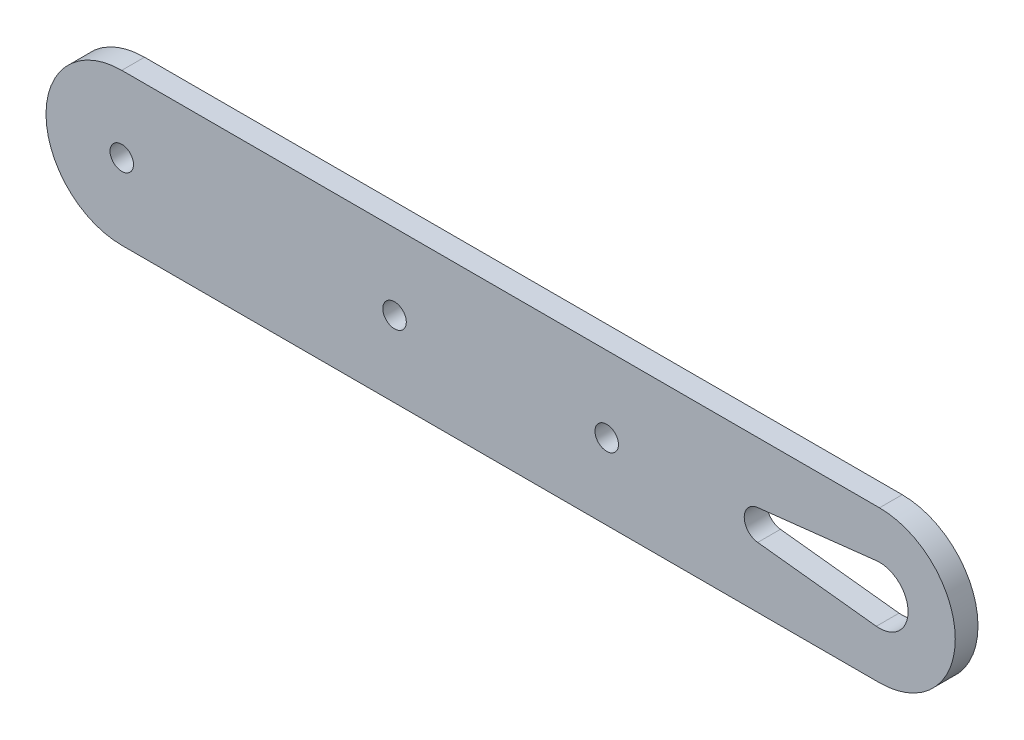
ISO-10303-21;
HEADER;
FILE_DESCRIPTION(('STEP AP214'),'2;1');
FILE_NAME('part.step','',(''),(''),'','','');
FILE_SCHEMA(('AUTOMOTIVE_DESIGN { 1 0 10303 214 1 1 1 1 }'));
ENDSEC;
DATA;
#1=APPLICATION_CONTEXT('core data for automotive mechanical design processes');
#2=APPLICATION_PROTOCOL_DEFINITION('international standard','automotive_design',2000,#1);
#3=PRODUCT_CONTEXT('',#1,'mechanical');
#4=PRODUCT('Part','Part','',(#3));
#5=PRODUCT_RELATED_PRODUCT_CATEGORY('part','',(#4));
#6=PRODUCT_DEFINITION_FORMATION('','',#4);
#7=PRODUCT_DEFINITION_CONTEXT('part definition',#1,'design');
#8=PRODUCT_DEFINITION('design','',#6,#7);
#9=PRODUCT_DEFINITION_SHAPE('','',#8);
#10=(LENGTH_UNIT() NAMED_UNIT(*) SI_UNIT(.MILLI.,.METRE.));
#11=(NAMED_UNIT(*) PLANE_ANGLE_UNIT() SI_UNIT($,.RADIAN.));
#12=(NAMED_UNIT(*) SI_UNIT($,.STERADIAN.) SOLID_ANGLE_UNIT());
#13=UNCERTAINTY_MEASURE_WITH_UNIT(LENGTH_MEASURE(1.E-05),#10,'distance_accuracy_value','');
#14=(GEOMETRIC_REPRESENTATION_CONTEXT(3) GLOBAL_UNCERTAINTY_ASSIGNED_CONTEXT((#13)) GLOBAL_UNIT_ASSIGNED_CONTEXT((#10,
#11,#12)) REPRESENTATION_CONTEXT('',''));
#15=CARTESIAN_POINT('',(0.,0.,0.));
#16=DIRECTION('',(0.,0.,1.));
#17=DIRECTION('',(1.,0.,0.));
#18=AXIS2_PLACEMENT_3D('',#15,#16,#17);
#19=CARTESIAN_POINT('',(-58.0586172408633,14.1910905170263,3.));
#20=DIRECTION('',(0.,0.,-1.));
#21=DIRECTION('',(-1.,0.,0.));
#22=AXIS2_PLACEMENT_3D('',#19,#20,#21);
#23=CYLINDRICAL_SURFACE('',#22,10.);
#24=CARTESIAN_POINT('',(-58.0586172408633,14.1910905170263,0.));
#25=DIRECTION('',(0.,0.,1.));
#26=DIRECTION('',(1.,0.,0.));
#27=AXIS2_PLACEMENT_3D('',#24,#25,#26);
#28=CIRCLE('',#27,10.);
#29=CARTESIAN_POINT('',(-58.0586172408633,24.1910905170263,0.));
#30=VERTEX_POINT('',#29);
#31=CARTESIAN_POINT('',(-58.0586172408633,4.19109051702633,0.));
#32=VERTEX_POINT('',#31);
#33=EDGE_CURVE('E156',#30,#32,#28,.T.);
#34=ORIENTED_EDGE('',*,*,#33,.T.);
#35=DIRECTION('',(0.,0.,-1.));
#36=VECTOR('',#35,1.);
#37=CARTESIAN_POINT('',(-58.0586172408633,4.19109051702633,3.));
#38=LINE('',#37,#36);
#39=CARTESIAN_POINT('',(-58.0586172408633,4.19109051702633,3.));
#40=VERTEX_POINT('',#39);
#41=EDGE_CURVE('E11',#40,#32,#38,.T.);
#42=ORIENTED_EDGE('',*,*,#41,.F.);
#43=CARTESIAN_POINT('',(-58.0586172408633,14.1910905170263,3.));
#44=DIRECTION('',(0.,0.,1.));
#45=DIRECTION('',(1.,0.,0.));
#46=AXIS2_PLACEMENT_3D('',#43,#44,#45);
#47=CIRCLE('',#46,10.);
#48=CARTESIAN_POINT('',(-58.0586172408633,24.1910905170263,3.));
#49=VERTEX_POINT('',#48);
#50=EDGE_CURVE('E162',#49,#40,#47,.T.);
#51=ORIENTED_EDGE('',*,*,#50,.F.);
#52=DIRECTION('',(0.,0.,-1.));
#53=VECTOR('',#52,1.);
#54=CARTESIAN_POINT('',(-58.0586172408633,24.1910905170263,3.));
#55=LINE('',#54,#53);
#56=EDGE_CURVE('E176',#49,#30,#55,.T.);
#57=ORIENTED_EDGE('',*,*,#56,.T.);
#58=EDGE_LOOP('',(#34,#42,#51,#57));
#59=FACE_BOUND('',#58,.T.);
#60=ADVANCED_FACE('F44',(#59),#23,.T.);
#61=CARTESIAN_POINT('',(-58.0586172408633,4.19109051702633,3.));
#62=DIRECTION('',(0.,1.,0.));
#63=DIRECTION('',(0.,0.,1.));
#64=AXIS2_PLACEMENT_3D('',#61,#62,#63);
#65=PLANE('',#64);
#66=DIRECTION('',(1.,0.,0.));
#67=VECTOR('',#66,1.);
#68=CARTESIAN_POINT('',(-58.0586172408633,4.19109051702633,0.));
#69=LINE('',#68,#67);
#70=CARTESIAN_POINT('',(41.9413827591368,4.19109051702633,0.));
#71=VERTEX_POINT('',#70);
#72=EDGE_CURVE('E180',#32,#71,#69,.T.);
#73=ORIENTED_EDGE('',*,*,#72,.T.);
#74=DIRECTION('',(0.,0.,-1.));
#75=VECTOR('',#74,1.);
#76=CARTESIAN_POINT('',(41.9413827591368,4.19109051702633,3.));
#77=LINE('',#76,#75);
#78=CARTESIAN_POINT('',(41.9413827591368,4.19109051702633,3.));
#79=VERTEX_POINT('',#78);
#80=EDGE_CURVE('E52',#79,#71,#77,.T.);
#81=ORIENTED_EDGE('',*,*,#80,.F.);
#82=DIRECTION('',(1.,0.,0.));
#83=VECTOR('',#82,1.);
#84=CARTESIAN_POINT('',(-58.0586172408633,4.19109051702633,3.));
#85=LINE('',#84,#83);
#86=EDGE_CURVE('E166',#40,#79,#85,.T.);
#87=ORIENTED_EDGE('',*,*,#86,.F.);
#88=ORIENTED_EDGE('',*,*,#41,.T.);
#89=EDGE_LOOP('',(#73,#81,#87,#88));
#90=FACE_BOUND('',#89,.T.);
#91=ADVANCED_FACE('F214',(#90),#65,.F.);
#92=CARTESIAN_POINT('',(41.9413827591368,14.1910905170263,3.));
#93=DIRECTION('',(0.,0.,-1.));
#94=DIRECTION('',(-1.,0.,0.));
#95=AXIS2_PLACEMENT_3D('',#92,#93,#94);
#96=CYLINDRICAL_SURFACE('',#95,10.);
#97=CARTESIAN_POINT('',(41.9413827591368,14.1910905170263,0.));
#98=DIRECTION('',(0.,0.,1.));
#99=DIRECTION('',(1.,0.,0.));
#100=AXIS2_PLACEMENT_3D('',#97,#98,#99);
#101=CIRCLE('',#100,10.);
#102=CARTESIAN_POINT('',(41.9413827591368,24.1910905170263,0.));
#103=VERTEX_POINT('',#102);
#104=EDGE_CURVE('E183',#71,#103,#101,.T.);
#105=ORIENTED_EDGE('',*,*,#104,.T.);
#106=DIRECTION('',(0.,0.,-1.));
#107=VECTOR('',#106,1.);
#108=CARTESIAN_POINT('',(41.9413827591368,24.1910905170263,3.));
#109=LINE('',#108,#107);
#110=CARTESIAN_POINT('',(41.9413827591368,24.1910905170263,3.));
#111=VERTEX_POINT('',#110);
#112=EDGE_CURVE('E191',#111,#103,#109,.T.);
#113=ORIENTED_EDGE('',*,*,#112,.F.);
#114=CARTESIAN_POINT('',(41.9413827591368,14.1910905170263,3.));
#115=DIRECTION('',(0.,0.,1.));
#116=DIRECTION('',(1.,0.,0.));
#117=AXIS2_PLACEMENT_3D('',#114,#115,#116);
#118=CIRCLE('',#117,10.);
#119=EDGE_CURVE('E170',#79,#111,#118,.T.);
#120=ORIENTED_EDGE('',*,*,#119,.F.);
#121=ORIENTED_EDGE('',*,*,#80,.T.);
#122=EDGE_LOOP('',(#105,#113,#120,#121));
#123=FACE_BOUND('',#122,.T.);
#124=ADVANCED_FACE('F200',(#123),#96,.T.);
#125=CARTESIAN_POINT('',(-58.0586172408633,24.1910905170263,3.));
#126=DIRECTION('',(0.,-1.,0.));
#127=DIRECTION('',(0.,0.,-1.));
#128=AXIS2_PLACEMENT_3D('',#125,#126,#127);
#129=PLANE('',#128);
#130=DIRECTION('',(-1.,0.,0.));
#131=VECTOR('',#130,1.);
#132=CARTESIAN_POINT('',(-58.0586172408633,24.1910905170263,0.));
#133=LINE('',#132,#131);
#134=EDGE_CURVE('E167',#103,#30,#133,.T.);
#135=ORIENTED_EDGE('',*,*,#134,.T.);
#136=ORIENTED_EDGE('',*,*,#56,.F.);
#137=DIRECTION('',(-1.,0.,0.));
#138=VECTOR('',#137,1.);
#139=CARTESIAN_POINT('',(-58.0586172408633,24.1910905170263,3.));
#140=LINE('',#139,#138);
#141=EDGE_CURVE('E173',#111,#49,#140,.T.);
#142=ORIENTED_EDGE('',*,*,#141,.F.);
#143=ORIENTED_EDGE('',*,*,#112,.T.);
#144=EDGE_LOOP('',(#135,#136,#142,#143));
#145=FACE_BOUND('',#144,.T.);
#146=ADVANCED_FACE('F207',(#145),#129,.F.);
#147=CARTESIAN_POINT('',(-58.0586172408633,14.1910905170263,3.));
#148=DIRECTION('',(0.,0.,1.));
#149=DIRECTION('',(1.,0.,0.));
#150=AXIS2_PLACEMENT_3D('',#147,#148,#149);
#151=PLANE('',#150);
#152=CARTESIAN_POINT('',(-22.0586172408633,14.1910905170263,3.));
#153=DIRECTION('',(0.,0.,-1.));
#154=DIRECTION('',(-1.,0.,0.));
#155=AXIS2_PLACEMENT_3D('',#152,#153,#154);
#156=CIRCLE('',#155,1.55);
#157=CARTESIAN_POINT('',(-23.6086172408633,14.1910905170263,3.));
#158=VERTEX_POINT('',#157);
#159=EDGE_CURVE('E257',#158,#158,#156,.T.);
#160=ORIENTED_EDGE('',*,*,#159,.T.);
#161=EDGE_LOOP('',(#160));
#162=FACE_BOUND('',#161,.T.);
#163=CARTESIAN_POINT('',(5.94138275913676,14.1910905170263,3.));
#164=DIRECTION('',(0.,0.,1.));
#165=DIRECTION('',(1.,0.,0.));
#166=AXIS2_PLACEMENT_3D('',#163,#164,#165);
#167=CIRCLE('',#166,1.55);
#168=CARTESIAN_POINT('',(7.49138275913676,14.1910905170263,3.));
#169=VERTEX_POINT('',#168);
#170=EDGE_CURVE('E264',#169,#169,#167,.T.);
#171=ORIENTED_EDGE('',*,*,#170,.F.);
#172=EDGE_LOOP('',(#171));
#173=FACE_BOUND('',#172,.T.);
#174=CARTESIAN_POINT('',(-58.0586172408633,14.1910905170263,3.));
#175=DIRECTION('',(0.,0.,1.));
#176=DIRECTION('',(1.,0.,0.));
#177=AXIS2_PLACEMENT_3D('',#174,#175,#176);
#178=CIRCLE('',#177,1.55);
#179=CARTESIAN_POINT('',(-56.5086172408633,14.1910905170263,3.));
#180=VERTEX_POINT('',#179);
#181=EDGE_CURVE('E137',#180,#180,#178,.T.);
#182=ORIENTED_EDGE('',*,*,#181,.F.);
#183=EDGE_LOOP('',(#182));
#184=FACE_BOUND('',#183,.T.);
#185=CARTESIAN_POINT('',(41.9413827591368,14.1910905170263,3.));
#186=DIRECTION('',(0.,0.,1.));
#187=DIRECTION('',(-1.,0.,0.));
#188=AXIS2_PLACEMENT_3D('',#185,#186,#187);
#189=CIRCLE('',#188,3.77357221670818);
#190=CARTESIAN_POINT('',(41.5202565610537,10.4410905170263,3.));
#191=VERTEX_POINT('',#190);
#192=CARTESIAN_POINT('',(41.5202565610537,17.9410905170263,3.));
#193=VERTEX_POINT('',#192);
#194=EDGE_CURVE('E59',#191,#193,#189,.T.);
#195=ORIENTED_EDGE('',*,*,#194,.F.);
#196=DIRECTION('',(0.993753341567491,-0.11159881775111,0.));
#197=VECTOR('',#196,1.);
#198=CARTESIAN_POINT('',(41.5202565610537,10.4410905170263,3.));
#199=LINE('',#198,#197);
#200=CARTESIAN_POINT('',(25.8702565610537,12.1985905170263,3.));
#201=VERTEX_POINT('',#200);
#202=EDGE_CURVE('E130',#201,#191,#199,.T.);
#203=ORIENTED_EDGE('',*,*,#202,.F.);
#204=CARTESIAN_POINT('',(26.0940149476352,14.1910905170263,3.));
#205=DIRECTION('',(0.,0.,1.));
#206=DIRECTION('',(1.,0.,0.));
#207=AXIS2_PLACEMENT_3D('',#204,#205,#206);
#208=CIRCLE('',#207,2.00502470447761);
#209=CARTESIAN_POINT('',(25.8702565610537,16.1835905170263,3.));
#210=VERTEX_POINT('',#209);
#211=EDGE_CURVE('E134',#210,#201,#208,.T.);
#212=ORIENTED_EDGE('',*,*,#211,.F.);
#213=DIRECTION('',(-0.993753341567491,-0.11159881775111,0.));
#214=VECTOR('',#213,1.);
#215=CARTESIAN_POINT('',(41.5202565610537,17.9410905170263,3.));
#216=LINE('',#215,#214);
#217=EDGE_CURVE('E146',#193,#210,#216,.T.);
#218=ORIENTED_EDGE('',*,*,#217,.F.);
#219=EDGE_LOOP('',(#195,#203,#212,#218));
#220=FACE_BOUND('',#219,.T.);
#221=ORIENTED_EDGE('',*,*,#50,.T.);
#222=ORIENTED_EDGE('',*,*,#86,.T.);
#223=ORIENTED_EDGE('',*,*,#119,.T.);
#224=ORIENTED_EDGE('',*,*,#141,.T.);
#225=EDGE_LOOP('',(#221,#222,#223,#224));
#226=FACE_BOUND('',#225,.T.);
#227=ADVANCED_FACE('F213',(#162,#173,#184,#220,#226),#151,.T.);
#228=CARTESIAN_POINT('',(-58.0586172408633,14.1910905170263,0.));
#229=DIRECTION('',(0.,0.,1.));
#230=DIRECTION('',(1.,0.,0.));
#231=AXIS2_PLACEMENT_3D('',#228,#229,#230);
#232=PLANE('',#231);
#233=CARTESIAN_POINT('',(-22.0586172408633,14.1910905170263,0.));
#234=DIRECTION('',(0.,0.,-1.));
#235=DIRECTION('',(-1.,0.,0.));
#236=AXIS2_PLACEMENT_3D('',#233,#234,#235);
#237=CIRCLE('',#236,1.55);
#238=CARTESIAN_POINT('',(-23.6086172408633,14.1910905170263,0.));
#239=VERTEX_POINT('',#238);
#240=EDGE_CURVE('E260',#239,#239,#237,.T.);
#241=ORIENTED_EDGE('',*,*,#240,.F.);
#242=EDGE_LOOP('',(#241));
#243=FACE_BOUND('',#242,.T.);
#244=CARTESIAN_POINT('',(5.94138275913676,14.1910905170263,0.));
#245=DIRECTION('',(0.,0.,1.));
#246=DIRECTION('',(1.,0.,0.));
#247=AXIS2_PLACEMENT_3D('',#244,#245,#246);
#248=CIRCLE('',#247,1.55);
#249=CARTESIAN_POINT('',(7.49138275913676,14.1910905170263,0.));
#250=VERTEX_POINT('',#249);
#251=EDGE_CURVE('E267',#250,#250,#248,.T.);
#252=ORIENTED_EDGE('',*,*,#251,.T.);
#253=EDGE_LOOP('',(#252));
#254=FACE_BOUND('',#253,.T.);
#255=CARTESIAN_POINT('',(-58.0586172408633,14.1910905170263,0.));
#256=DIRECTION('',(0.,0.,1.));
#257=DIRECTION('',(1.,0.,0.));
#258=AXIS2_PLACEMENT_3D('',#255,#256,#257);
#259=CIRCLE('',#258,1.55);
#260=CARTESIAN_POINT('',(-56.5086172408633,14.1910905170263,0.));
#261=VERTEX_POINT('',#260);
#262=EDGE_CURVE('E147',#261,#261,#259,.T.);
#263=ORIENTED_EDGE('',*,*,#262,.T.);
#264=EDGE_LOOP('',(#263));
#265=FACE_BOUND('',#264,.T.);
#266=DIRECTION('',(0.993753341567491,-0.11159881775111,0.));
#267=VECTOR('',#266,1.);
#268=CARTESIAN_POINT('',(41.5202565610537,10.4410905170263,0.));
#269=LINE('',#268,#267);
#270=CARTESIAN_POINT('',(25.8702565610537,12.1985905170263,0.));
#271=VERTEX_POINT('',#270);
#272=CARTESIAN_POINT('',(41.5202565610537,10.4410905170263,0.));
#273=VERTEX_POINT('',#272);
#274=EDGE_CURVE('E118',#271,#273,#269,.T.);
#275=ORIENTED_EDGE('',*,*,#274,.T.);
#276=CARTESIAN_POINT('',(41.9413827591368,14.1910905170263,0.));
#277=DIRECTION('',(0.,0.,1.));
#278=DIRECTION('',(-1.,0.,0.));
#279=AXIS2_PLACEMENT_3D('',#276,#277,#278);
#280=CIRCLE('',#279,3.77357221670818);
#281=CARTESIAN_POINT('',(41.5202565610537,17.9410905170263,0.));
#282=VERTEX_POINT('',#281);
#283=EDGE_CURVE('E111',#273,#282,#280,.T.);
#284=ORIENTED_EDGE('',*,*,#283,.T.);
#285=DIRECTION('',(-0.993753341567491,-0.11159881775111,0.));
#286=VECTOR('',#285,1.);
#287=CARTESIAN_POINT('',(41.5202565610537,17.9410905170263,0.));
#288=LINE('',#287,#286);
#289=CARTESIAN_POINT('',(25.8702565610537,16.1835905170263,0.));
#290=VERTEX_POINT('',#289);
#291=EDGE_CURVE('E121',#282,#290,#288,.T.);
#292=ORIENTED_EDGE('',*,*,#291,.T.);
#293=CARTESIAN_POINT('',(26.0940149476352,14.1910905170263,0.));
#294=DIRECTION('',(0.,0.,1.));
#295=DIRECTION('',(1.,0.,0.));
#296=AXIS2_PLACEMENT_3D('',#293,#294,#295);
#297=CIRCLE('',#296,2.00502470447761);
#298=EDGE_CURVE('E67',#290,#271,#297,.T.);
#299=ORIENTED_EDGE('',*,*,#298,.T.);
#300=EDGE_LOOP('',(#275,#284,#292,#299));
#301=FACE_BOUND('',#300,.T.);
#302=ORIENTED_EDGE('',*,*,#33,.F.);
#303=ORIENTED_EDGE('',*,*,#134,.F.);
#304=ORIENTED_EDGE('',*,*,#104,.F.);
#305=ORIENTED_EDGE('',*,*,#72,.F.);
#306=EDGE_LOOP('',(#302,#303,#304,#305));
#307=FACE_BOUND('',#306,.T.);
#308=ADVANCED_FACE('F126',(#243,#254,#265,#301,#307),#232,.F.);
#309=CARTESIAN_POINT('',(41.9413827591368,14.1910905170263,0.));
#310=DIRECTION('',(0.,0.,1.));
#311=DIRECTION('',(1.,0.,0.));
#312=AXIS2_PLACEMENT_3D('',#309,#310,#311);
#313=CYLINDRICAL_SURFACE('',#312,3.77357221670818);
#314=ORIENTED_EDGE('',*,*,#194,.T.);
#315=DIRECTION('',(0.,0.,1.));
#316=VECTOR('',#315,1.);
#317=CARTESIAN_POINT('',(41.5202565610537,17.9410905170263,0.));
#318=LINE('',#317,#316);
#319=EDGE_CURVE('E107',#282,#193,#318,.T.);
#320=ORIENTED_EDGE('',*,*,#319,.F.);
#321=ORIENTED_EDGE('',*,*,#283,.F.);
#322=DIRECTION('',(0.,0.,1.));
#323=VECTOR('',#322,1.);
#324=CARTESIAN_POINT('',(41.5202565610537,10.4410905170263,0.));
#325=LINE('',#324,#323);
#326=EDGE_CURVE('E153',#273,#191,#325,.T.);
#327=ORIENTED_EDGE('',*,*,#326,.T.);
#328=EDGE_LOOP('',(#314,#320,#321,#327));
#329=FACE_BOUND('',#328,.T.);
#330=ADVANCED_FACE('F109',(#329),#313,.F.);
#331=CARTESIAN_POINT('',(41.5202565610537,10.4410905170263,0.));
#332=DIRECTION('',(-0.11159881775111,-0.993753341567491,0.));
#333=DIRECTION('',(0.993753341567491,-0.11159881775111,0.));
#334=AXIS2_PLACEMENT_3D('',#331,#332,#333);
#335=PLANE('',#334);
#336=ORIENTED_EDGE('',*,*,#202,.T.);
#337=ORIENTED_EDGE('',*,*,#326,.F.);
#338=ORIENTED_EDGE('',*,*,#274,.F.);
#339=DIRECTION('',(0.,0.,1.));
#340=VECTOR('',#339,1.);
#341=CARTESIAN_POINT('',(25.8702565610537,12.1985905170263,0.));
#342=LINE('',#341,#340);
#343=EDGE_CURVE('E157',#271,#201,#342,.T.);
#344=ORIENTED_EDGE('',*,*,#343,.T.);
#345=EDGE_LOOP('',(#336,#337,#338,#344));
#346=FACE_BOUND('',#345,.T.);
#347=ADVANCED_FACE('F232',(#346),#335,.F.);
#348=CARTESIAN_POINT('',(26.0940149476352,14.1910905170263,0.));
#349=DIRECTION('',(0.,0.,1.));
#350=DIRECTION('',(1.,0.,0.));
#351=AXIS2_PLACEMENT_3D('',#348,#349,#350);
#352=CYLINDRICAL_SURFACE('',#351,2.00502470447761);
#353=ORIENTED_EDGE('',*,*,#211,.T.);
#354=ORIENTED_EDGE('',*,*,#343,.F.);
#355=ORIENTED_EDGE('',*,*,#298,.F.);
#356=DIRECTION('',(0.,0.,1.));
#357=VECTOR('',#356,1.);
#358=CARTESIAN_POINT('',(25.8702565610537,16.1835905170263,0.));
#359=LINE('',#358,#357);
#360=EDGE_CURVE('E117',#290,#210,#359,.T.);
#361=ORIENTED_EDGE('',*,*,#360,.T.);
#362=EDGE_LOOP('',(#353,#354,#355,#361));
#363=FACE_BOUND('',#362,.T.);
#364=ADVANCED_FACE('F236',(#363),#352,.F.);
#365=CARTESIAN_POINT('',(41.5202565610537,17.9410905170263,0.));
#366=DIRECTION('',(-0.11159881775111,0.993753341567491,0.));
#367=DIRECTION('',(-0.993753341567491,-0.11159881775111,0.));
#368=AXIS2_PLACEMENT_3D('',#365,#366,#367);
#369=PLANE('',#368);
#370=ORIENTED_EDGE('',*,*,#217,.T.);
#371=ORIENTED_EDGE('',*,*,#360,.F.);
#372=ORIENTED_EDGE('',*,*,#291,.F.);
#373=ORIENTED_EDGE('',*,*,#319,.T.);
#374=EDGE_LOOP('',(#370,#371,#372,#373));
#375=FACE_BOUND('',#374,.T.);
#376=ADVANCED_FACE('F122',(#375),#369,.F.);
#377=CARTESIAN_POINT('',(-58.0586172408633,14.1910905170263,0.));
#378=DIRECTION('',(0.,0.,1.));
#379=DIRECTION('',(1.,0.,0.));
#380=AXIS2_PLACEMENT_3D('',#377,#378,#379);
#381=CYLINDRICAL_SURFACE('',#380,1.55);
#382=ORIENTED_EDGE('',*,*,#262,.F.);
#383=EDGE_LOOP('',(#382));
#384=FACE_BOUND('',#383,.T.);
#385=ORIENTED_EDGE('',*,*,#181,.T.);
#386=EDGE_LOOP('',(#385));
#387=FACE_BOUND('',#386,.T.);
#388=ADVANCED_FACE('F235',(#384,#387),#381,.F.);
#389=CARTESIAN_POINT('',(5.94138275913676,14.1910905170263,0.));
#390=DIRECTION('',(0.,0.,1.));
#391=DIRECTION('',(1.,0.,0.));
#392=AXIS2_PLACEMENT_3D('',#389,#390,#391);
#393=CYLINDRICAL_SURFACE('',#392,1.55);
#394=ORIENTED_EDGE('',*,*,#251,.F.);
#395=EDGE_LOOP('',(#394));
#396=FACE_BOUND('',#395,.T.);
#397=ORIENTED_EDGE('',*,*,#170,.T.);
#398=EDGE_LOOP('',(#397));
#399=FACE_BOUND('',#398,.T.);
#400=ADVANCED_FACE('F244',(#396,#399),#393,.F.);
#401=CARTESIAN_POINT('',(-22.0586172408633,14.1910905170263,3.));
#402=DIRECTION('',(0.,0.,-1.));
#403=DIRECTION('',(-1.,0.,0.));
#404=AXIS2_PLACEMENT_3D('',#401,#402,#403);
#405=CYLINDRICAL_SURFACE('',#404,1.55);
#406=ORIENTED_EDGE('',*,*,#159,.F.);
#407=EDGE_LOOP('',(#406));
#408=FACE_BOUND('',#407,.T.);
#409=ORIENTED_EDGE('',*,*,#240,.T.);
#410=EDGE_LOOP('',(#409));
#411=FACE_BOUND('',#410,.T.);
#412=ADVANCED_FACE('F248',(#408,#411),#405,.F.);
#413=CLOSED_SHELL('',(#60,#91,#124,#146,#227,#308,#330,#347,#364,#376,#388,#400,#412));
#414=MANIFOLD_SOLID_BREP('B2',#413);
#415=ADVANCED_BREP_SHAPE_REPRESENTATION('',(#18,#414),#14);
#416=SHAPE_DEFINITION_REPRESENTATION(#9,#415);
ENDSEC;
END-ISO-10303-21;
